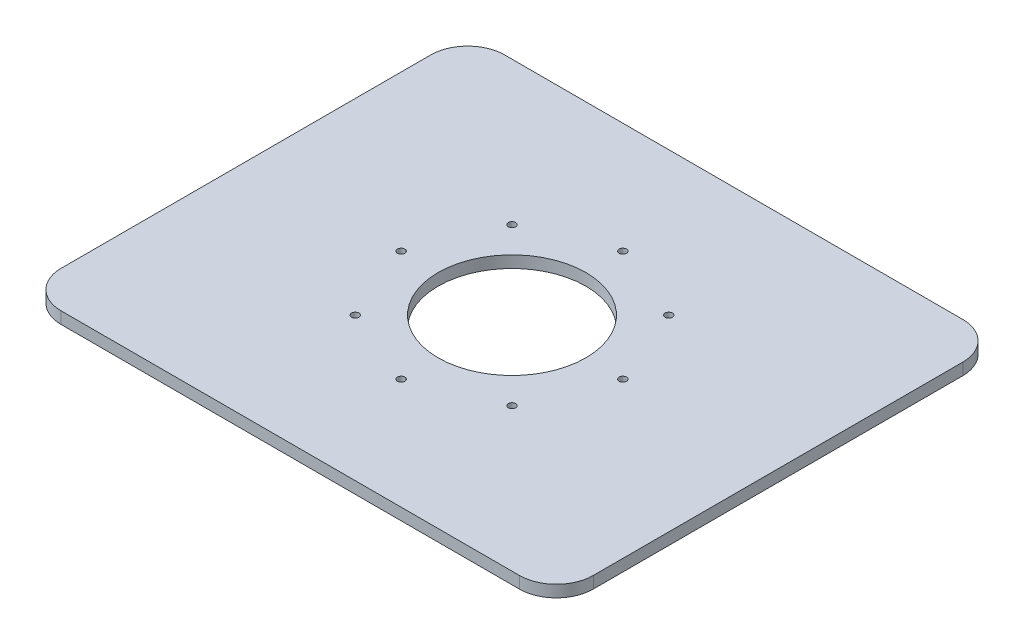
ISO-10303-21;
HEADER;
FILE_DESCRIPTION(('STEP AP214'),'2;1');
FILE_NAME('part.step','',(''),(''),'','','');
FILE_SCHEMA(('AUTOMOTIVE_DESIGN { 1 0 10303 214 1 1 1 1 }'));
ENDSEC;
DATA;
#1=APPLICATION_CONTEXT('core data for automotive mechanical design processes');
#2=APPLICATION_PROTOCOL_DEFINITION('international standard','automotive_design',2000,#1);
#3=PRODUCT_CONTEXT('',#1,'mechanical');
#4=PRODUCT('Part','Part','',(#3));
#5=PRODUCT_RELATED_PRODUCT_CATEGORY('part','',(#4));
#6=PRODUCT_DEFINITION_FORMATION('','',#4);
#7=PRODUCT_DEFINITION_CONTEXT('part definition',#1,'design');
#8=PRODUCT_DEFINITION('design','',#6,#7);
#9=PRODUCT_DEFINITION_SHAPE('','',#8);
#10=(LENGTH_UNIT() NAMED_UNIT(*) SI_UNIT(.MILLI.,.METRE.));
#11=(NAMED_UNIT(*) PLANE_ANGLE_UNIT() SI_UNIT($,.RADIAN.));
#12=(NAMED_UNIT(*) SI_UNIT($,.STERADIAN.) SOLID_ANGLE_UNIT());
#13=UNCERTAINTY_MEASURE_WITH_UNIT(LENGTH_MEASURE(1.E-05),#10,'distance_accuracy_value','');
#14=(GEOMETRIC_REPRESENTATION_CONTEXT(3) GLOBAL_UNCERTAINTY_ASSIGNED_CONTEXT((#13)) GLOBAL_UNIT_ASSIGNED_CONTEXT((#10,
#11,#12)) REPRESENTATION_CONTEXT('',''));
#15=CARTESIAN_POINT('',(0.,0.,0.));
#16=DIRECTION('',(0.,0.,1.));
#17=DIRECTION('',(1.,0.,0.));
#18=AXIS2_PLACEMENT_3D('',#15,#16,#17);
#19=CARTESIAN_POINT('',(310.,16.,250.));
#20=DIRECTION('',(0.,1.,0.));
#21=DIRECTION('',(1.,0.,0.));
#22=AXIS2_PLACEMENT_3D('',#19,#20,#21);
#23=PLANE('',#22);
#24=CARTESIAN_POINT('',(-106.066017178,16.,-106.066017178));
#25=DIRECTION('',(0.,1.,0.));
#26=DIRECTION('',(0.,0.,1.));
#27=AXIS2_PLACEMENT_3D('',#24,#25,#26);
#28=CIRCLE('',#27,5.);
#29=CARTESIAN_POINT('',(-106.066017178,16.,-101.066017178));
#30=VERTEX_POINT('',#29);
#31=EDGE_CURVE('E183',#30,#30,#28,.T.);
#32=ORIENTED_EDGE('',*,*,#31,.F.);
#33=EDGE_LOOP('',(#32));
#34=FACE_BOUND('',#33,.T.);
#35=CARTESIAN_POINT('',(0.,16.,-150.));
#36=DIRECTION('',(0.,1.,0.));
#37=DIRECTION('',(0.,0.,1.));
#38=AXIS2_PLACEMENT_3D('',#35,#36,#37);
#39=CIRCLE('',#38,5.);
#40=CARTESIAN_POINT('',(0.,16.,-145.));
#41=VERTEX_POINT('',#40);
#42=EDGE_CURVE('E207',#41,#41,#39,.T.);
#43=ORIENTED_EDGE('',*,*,#42,.F.);
#44=EDGE_LOOP('',(#43));
#45=FACE_BOUND('',#44,.T.);
#46=CARTESIAN_POINT('',(150.,16.,0.));
#47=DIRECTION('',(0.,1.,0.));
#48=DIRECTION('',(0.,0.,1.));
#49=AXIS2_PLACEMENT_3D('',#46,#47,#48);
#50=CIRCLE('',#49,5.);
#51=CARTESIAN_POINT('',(150.,16.,5.));
#52=VERTEX_POINT('',#51);
#53=EDGE_CURVE('E191',#52,#52,#50,.T.);
#54=ORIENTED_EDGE('',*,*,#53,.F.);
#55=EDGE_LOOP('',(#54));
#56=FACE_BOUND('',#55,.T.);
#57=CARTESIAN_POINT('',(0.,16.,150.));
#58=DIRECTION('',(0.,1.,0.));
#59=DIRECTION('',(0.,0.,1.));
#60=AXIS2_PLACEMENT_3D('',#57,#58,#59);
#61=CIRCLE('',#60,5.);
#62=CARTESIAN_POINT('',(0.,16.,155.));
#63=VERTEX_POINT('',#62);
#64=EDGE_CURVE('E227',#63,#63,#61,.T.);
#65=ORIENTED_EDGE('',*,*,#64,.F.);
#66=EDGE_LOOP('',(#65));
#67=FACE_BOUND('',#66,.T.);
#68=CARTESIAN_POINT('',(-150.,16.,0.));
#69=DIRECTION('',(0.,1.,0.));
#70=DIRECTION('',(0.,0.,1.));
#71=AXIS2_PLACEMENT_3D('',#68,#69,#70);
#72=CIRCLE('',#71,5.);
#73=CARTESIAN_POINT('',(-150.,16.,4.99999999999998));
#74=VERTEX_POINT('',#73);
#75=EDGE_CURVE('E156',#74,#74,#72,.T.);
#76=ORIENTED_EDGE('',*,*,#75,.F.);
#77=EDGE_LOOP('',(#76));
#78=FACE_BOUND('',#77,.T.);
#79=CARTESIAN_POINT('',(-106.066017178,16.,106.066017178));
#80=DIRECTION('',(0.,1.,0.));
#81=DIRECTION('',(0.,0.,1.));
#82=AXIS2_PLACEMENT_3D('',#79,#80,#81);
#83=CIRCLE('',#82,5.);
#84=CARTESIAN_POINT('',(-106.066017178,16.,111.066017178));
#85=VERTEX_POINT('',#84);
#86=EDGE_CURVE('E218',#85,#85,#83,.T.);
#87=ORIENTED_EDGE('',*,*,#86,.F.);
#88=EDGE_LOOP('',(#87));
#89=FACE_BOUND('',#88,.T.);
#90=CARTESIAN_POINT('',(106.066017178,16.,106.066017178));
#91=DIRECTION('',(0.,1.,0.));
#92=DIRECTION('',(0.,0.,1.));
#93=AXIS2_PLACEMENT_3D('',#90,#91,#92);
#94=CIRCLE('',#93,5.);
#95=CARTESIAN_POINT('',(106.066017178,16.,111.066017178));
#96=VERTEX_POINT('',#95);
#97=EDGE_CURVE('E240',#96,#96,#94,.T.);
#98=ORIENTED_EDGE('',*,*,#97,.F.);
#99=EDGE_LOOP('',(#98));
#100=FACE_BOUND('',#99,.T.);
#101=CARTESIAN_POINT('',(106.066017178,16.,-106.066017178));
#102=DIRECTION('',(0.,1.,0.));
#103=DIRECTION('',(0.,0.,1.));
#104=AXIS2_PLACEMENT_3D('',#101,#102,#103);
#105=CIRCLE('',#104,5.);
#106=CARTESIAN_POINT('',(106.066017178,16.,-101.066017178));
#107=VERTEX_POINT('',#106);
#108=EDGE_CURVE('E198',#107,#107,#105,.T.);
#109=ORIENTED_EDGE('',*,*,#108,.F.);
#110=EDGE_LOOP('',(#109));
#111=FACE_BOUND('',#110,.T.);
#112=CARTESIAN_POINT('',(0.,16.,0.));
#113=DIRECTION('',(0.,1.,0.));
#114=DIRECTION('',(0.,0.,1.));
#115=AXIS2_PLACEMENT_3D('',#112,#113,#114);
#116=CIRCLE('',#115,100.);
#117=CARTESIAN_POINT('',(0.,16.,100.));
#118=VERTEX_POINT('',#117);
#119=EDGE_CURVE('E310',#118,#118,#116,.T.);
#120=ORIENTED_EDGE('',*,*,#119,.F.);
#121=EDGE_LOOP('',(#120));
#122=FACE_BOUND('',#121,.T.);
#123=CARTESIAN_POINT('',(310.,16.,250.));
#124=DIRECTION('',(0.,1.,0.));
#125=DIRECTION('',(0.,0.,1.));
#126=AXIS2_PLACEMENT_3D('',#123,#124,#125);
#127=CIRCLE('',#126,50.);
#128=CARTESIAN_POINT('',(310.,16.,300.));
#129=VERTEX_POINT('',#128);
#130=CARTESIAN_POINT('',(360.,16.,250.));
#131=VERTEX_POINT('',#130);
#132=EDGE_CURVE('E45',#129,#131,#127,.T.);
#133=ORIENTED_EDGE('',*,*,#132,.T.);
#134=DIRECTION('',(0.,0.,-1.));
#135=VECTOR('',#134,1.);
#136=CARTESIAN_POINT('',(360.,16.,250.));
#137=LINE('',#136,#135);
#138=CARTESIAN_POINT('',(360.,16.,-250.));
#139=VERTEX_POINT('',#138);
#140=EDGE_CURVE('E20',#131,#139,#137,.T.);
#141=ORIENTED_EDGE('',*,*,#140,.T.);
#142=CARTESIAN_POINT('',(310.,16.,-250.));
#143=DIRECTION('',(0.,1.,0.));
#144=DIRECTION('',(0.,0.,1.));
#145=AXIS2_PLACEMENT_3D('',#142,#143,#144);
#146=CIRCLE('',#145,50.);
#147=CARTESIAN_POINT('',(310.,16.,-300.));
#148=VERTEX_POINT('',#147);
#149=EDGE_CURVE('E114',#139,#148,#146,.T.);
#150=ORIENTED_EDGE('',*,*,#149,.T.);
#151=DIRECTION('',(-1.,0.,0.));
#152=VECTOR('',#151,1.);
#153=CARTESIAN_POINT('',(310.,16.,-300.));
#154=LINE('',#153,#152);
#155=CARTESIAN_POINT('',(-310.,16.,-300.));
#156=VERTEX_POINT('',#155);
#157=EDGE_CURVE('E203',#148,#156,#154,.T.);
#158=ORIENTED_EDGE('',*,*,#157,.T.);
#159=CARTESIAN_POINT('',(-310.,16.,-250.));
#160=DIRECTION('',(0.,1.,0.));
#161=DIRECTION('',(0.,0.,1.));
#162=AXIS2_PLACEMENT_3D('',#159,#160,#161);
#163=CIRCLE('',#162,50.);
#164=CARTESIAN_POINT('',(-360.,16.,-250.));
#165=VERTEX_POINT('',#164);
#166=EDGE_CURVE('E30',#156,#165,#163,.T.);
#167=ORIENTED_EDGE('',*,*,#166,.T.);
#168=DIRECTION('',(0.,0.,1.));
#169=VECTOR('',#168,1.);
#170=CARTESIAN_POINT('',(-360.,16.,-250.));
#171=LINE('',#170,#169);
#172=CARTESIAN_POINT('',(-360.,16.,250.));
#173=VERTEX_POINT('',#172);
#174=EDGE_CURVE('E132',#165,#173,#171,.T.);
#175=ORIENTED_EDGE('',*,*,#174,.T.);
#176=CARTESIAN_POINT('',(-310.,16.,250.));
#177=DIRECTION('',(0.,1.,0.));
#178=DIRECTION('',(0.,0.,1.));
#179=AXIS2_PLACEMENT_3D('',#176,#177,#178);
#180=CIRCLE('',#179,50.);
#181=CARTESIAN_POINT('',(-310.,16.,300.));
#182=VERTEX_POINT('',#181);
#183=EDGE_CURVE('E11',#173,#182,#180,.T.);
#184=ORIENTED_EDGE('',*,*,#183,.T.);
#185=DIRECTION('',(1.,0.,0.));
#186=VECTOR('',#185,1.);
#187=CARTESIAN_POINT('',(-310.,16.,300.));
#188=LINE('',#187,#186);
#189=EDGE_CURVE('E116',#182,#129,#188,.T.);
#190=ORIENTED_EDGE('',*,*,#189,.T.);
#191=EDGE_LOOP('',(#133,#141,#150,#158,#167,#175,#184,#190));
#192=FACE_BOUND('',#191,.T.);
#193=ADVANCED_FACE('F16',(#34,#45,#56,#67,#78,#89,#100,#111,#122,#192),#23,.T.);
#194=CARTESIAN_POINT('',(-310.,-937.229961108798,250.));
#195=DIRECTION('',(0.,1.,0.));
#196=DIRECTION('',(0.,0.,1.));
#197=AXIS2_PLACEMENT_3D('',#194,#195,#196);
#198=CYLINDRICAL_SURFACE('',#197,50.);
#199=CARTESIAN_POINT('',(-310.,0.,250.));
#200=DIRECTION('',(0.,-1.,0.));
#201=DIRECTION('',(0.,0.,1.));
#202=AXIS2_PLACEMENT_3D('',#199,#200,#201);
#203=CIRCLE('',#202,50.);
#204=CARTESIAN_POINT('',(-310.,0.,300.));
#205=VERTEX_POINT('',#204);
#206=CARTESIAN_POINT('',(-360.,0.,250.));
#207=VERTEX_POINT('',#206);
#208=EDGE_CURVE('E147',#205,#207,#203,.T.);
#209=ORIENTED_EDGE('',*,*,#208,.F.);
#210=DIRECTION('',(0.,-1.,0.));
#211=VECTOR('',#210,1.);
#212=CARTESIAN_POINT('',(-310.,-937.229961108798,300.));
#213=LINE('',#212,#211);
#214=EDGE_CURVE('E120',#182,#205,#213,.T.);
#215=ORIENTED_EDGE('',*,*,#214,.F.);
#216=ORIENTED_EDGE('',*,*,#183,.F.);
#217=DIRECTION('',(0.,1.,0.));
#218=VECTOR('',#217,1.);
#219=CARTESIAN_POINT('',(-360.,-937.229961108798,250.));
#220=LINE('',#219,#218);
#221=EDGE_CURVE('E199',#207,#173,#220,.T.);
#222=ORIENTED_EDGE('',*,*,#221,.F.);
#223=EDGE_LOOP('',(#209,#215,#216,#222));
#224=FACE_BOUND('',#223,.T.);
#225=ADVANCED_FACE('F18',(#224),#198,.T.);
#226=CARTESIAN_POINT('',(-310.,-937.229961108798,-250.));
#227=DIRECTION('',(0.,1.,0.));
#228=DIRECTION('',(0.,0.,1.));
#229=AXIS2_PLACEMENT_3D('',#226,#227,#228);
#230=CYLINDRICAL_SURFACE('',#229,50.);
#231=CARTESIAN_POINT('',(-310.,0.,-250.));
#232=DIRECTION('',(0.,-1.,0.));
#233=DIRECTION('',(0.,0.,1.));
#234=AXIS2_PLACEMENT_3D('',#231,#232,#233);
#235=CIRCLE('',#234,50.);
#236=CARTESIAN_POINT('',(-360.,0.,-250.));
#237=VERTEX_POINT('',#236);
#238=CARTESIAN_POINT('',(-310.,0.,-300.));
#239=VERTEX_POINT('',#238);
#240=EDGE_CURVE('E230',#237,#239,#235,.T.);
#241=ORIENTED_EDGE('',*,*,#240,.F.);
#242=DIRECTION('',(0.,-1.,0.));
#243=VECTOR('',#242,1.);
#244=CARTESIAN_POINT('',(-360.,-937.229961108798,-250.));
#245=LINE('',#244,#243);
#246=EDGE_CURVE('E126',#165,#237,#245,.T.);
#247=ORIENTED_EDGE('',*,*,#246,.F.);
#248=ORIENTED_EDGE('',*,*,#166,.F.);
#249=DIRECTION('',(0.,1.,0.));
#250=VECTOR('',#249,1.);
#251=CARTESIAN_POINT('',(-310.,-937.229961108798,-300.));
#252=LINE('',#251,#250);
#253=EDGE_CURVE('E231',#239,#156,#252,.T.);
#254=ORIENTED_EDGE('',*,*,#253,.F.);
#255=EDGE_LOOP('',(#241,#247,#248,#254));
#256=FACE_BOUND('',#255,.T.);
#257=ADVANCED_FACE('F358',(#256),#230,.T.);
#258=CARTESIAN_POINT('',(310.,-937.229961108798,250.));
#259=DIRECTION('',(0.,1.,0.));
#260=DIRECTION('',(0.,0.,1.));
#261=AXIS2_PLACEMENT_3D('',#258,#259,#260);
#262=CYLINDRICAL_SURFACE('',#261,50.);
#263=CARTESIAN_POINT('',(310.,0.,250.));
#264=DIRECTION('',(0.,-1.,0.));
#265=DIRECTION('',(0.,0.,1.));
#266=AXIS2_PLACEMENT_3D('',#263,#264,#265);
#267=CIRCLE('',#266,50.);
#268=CARTESIAN_POINT('',(360.,0.,250.));
#269=VERTEX_POINT('',#268);
#270=CARTESIAN_POINT('',(310.,0.,300.));
#271=VERTEX_POINT('',#270);
#272=EDGE_CURVE('E151',#269,#271,#267,.T.);
#273=ORIENTED_EDGE('',*,*,#272,.F.);
#274=DIRECTION('',(0.,-1.,0.));
#275=VECTOR('',#274,1.);
#276=CARTESIAN_POINT('',(360.,-937.229961108798,250.));
#277=LINE('',#276,#275);
#278=EDGE_CURVE('E109',#131,#269,#277,.T.);
#279=ORIENTED_EDGE('',*,*,#278,.F.);
#280=ORIENTED_EDGE('',*,*,#132,.F.);
#281=DIRECTION('',(0.,1.,0.));
#282=VECTOR('',#281,1.);
#283=CARTESIAN_POINT('',(310.,-937.229961108798,300.));
#284=LINE('',#283,#282);
#285=EDGE_CURVE('E107',#271,#129,#284,.T.);
#286=ORIENTED_EDGE('',*,*,#285,.F.);
#287=EDGE_LOOP('',(#273,#279,#280,#286));
#288=FACE_BOUND('',#287,.T.);
#289=ADVANCED_FACE('F106',(#288),#262,.T.);
#290=CARTESIAN_POINT('',(310.,-937.229961108798,-250.));
#291=DIRECTION('',(0.,1.,0.));
#292=DIRECTION('',(0.,0.,1.));
#293=AXIS2_PLACEMENT_3D('',#290,#291,#292);
#294=CYLINDRICAL_SURFACE('',#293,50.);
#295=CARTESIAN_POINT('',(310.,0.,-250.));
#296=DIRECTION('',(0.,-1.,0.));
#297=DIRECTION('',(0.,0.,1.));
#298=AXIS2_PLACEMENT_3D('',#295,#296,#297);
#299=CIRCLE('',#298,50.);
#300=CARTESIAN_POINT('',(310.,0.,-300.));
#301=VERTEX_POINT('',#300);
#302=CARTESIAN_POINT('',(360.,0.,-250.));
#303=VERTEX_POINT('',#302);
#304=EDGE_CURVE('E245',#301,#303,#299,.T.);
#305=ORIENTED_EDGE('',*,*,#304,.F.);
#306=DIRECTION('',(0.,-1.,0.));
#307=VECTOR('',#306,1.);
#308=CARTESIAN_POINT('',(310.,-937.229961108798,-300.));
#309=LINE('',#308,#307);
#310=EDGE_CURVE('E197',#148,#301,#309,.T.);
#311=ORIENTED_EDGE('',*,*,#310,.F.);
#312=ORIENTED_EDGE('',*,*,#149,.F.);
#313=DIRECTION('',(0.,1.,0.));
#314=VECTOR('',#313,1.);
#315=CARTESIAN_POINT('',(360.,-937.229961108798,-250.));
#316=LINE('',#315,#314);
#317=EDGE_CURVE('E264',#303,#139,#316,.T.);
#318=ORIENTED_EDGE('',*,*,#317,.F.);
#319=EDGE_LOOP('',(#305,#311,#312,#318));
#320=FACE_BOUND('',#319,.T.);
#321=ADVANCED_FACE('F284',(#320),#294,.T.);
#322=CARTESIAN_POINT('',(360.,-937.229961108798,300.));
#323=DIRECTION('',(1.,0.,0.));
#324=DIRECTION('',(0.,1.,0.));
#325=AXIS2_PLACEMENT_3D('',#322,#323,#324);
#326=PLANE('',#325);
#327=DIRECTION('',(0.,0.,1.));
#328=VECTOR('',#327,1.);
#329=CARTESIAN_POINT('',(360.,0.,300.));
#330=LINE('',#329,#328);
#331=EDGE_CURVE('E246',#303,#269,#330,.T.);
#332=ORIENTED_EDGE('',*,*,#331,.F.);
#333=ORIENTED_EDGE('',*,*,#317,.T.);
#334=ORIENTED_EDGE('',*,*,#140,.F.);
#335=ORIENTED_EDGE('',*,*,#278,.T.);
#336=EDGE_LOOP('',(#332,#333,#334,#335));
#337=FACE_BOUND('',#336,.T.);
#338=ADVANCED_FACE('F277',(#337),#326,.T.);
#339=CARTESIAN_POINT('',(-360.,-937.229961108798,300.));
#340=DIRECTION('',(0.,0.,1.));
#341=DIRECTION('',(1.,0.,0.));
#342=AXIS2_PLACEMENT_3D('',#339,#340,#341);
#343=PLANE('',#342);
#344=DIRECTION('',(-1.,0.,0.));
#345=VECTOR('',#344,1.);
#346=CARTESIAN_POINT('',(-360.,0.,300.));
#347=LINE('',#346,#345);
#348=EDGE_CURVE('E121',#271,#205,#347,.T.);
#349=ORIENTED_EDGE('',*,*,#348,.F.);
#350=ORIENTED_EDGE('',*,*,#285,.T.);
#351=ORIENTED_EDGE('',*,*,#189,.F.);
#352=ORIENTED_EDGE('',*,*,#214,.T.);
#353=EDGE_LOOP('',(#349,#350,#351,#352));
#354=FACE_BOUND('',#353,.T.);
#355=ADVANCED_FACE('F125',(#354),#343,.T.);
#356=CARTESIAN_POINT('',(-360.,-937.229961108798,300.));
#357=DIRECTION('',(-1.,0.,0.));
#358=DIRECTION('',(0.,0.,1.));
#359=AXIS2_PLACEMENT_3D('',#356,#357,#358);
#360=PLANE('',#359);
#361=ORIENTED_EDGE('',*,*,#221,.T.);
#362=ORIENTED_EDGE('',*,*,#174,.F.);
#363=ORIENTED_EDGE('',*,*,#246,.T.);
#364=DIRECTION('',(0.,0.,-1.));
#365=VECTOR('',#364,1.);
#366=CARTESIAN_POINT('',(-360.,0.,300.));
#367=LINE('',#366,#365);
#368=EDGE_CURVE('E233',#207,#237,#367,.T.);
#369=ORIENTED_EDGE('',*,*,#368,.F.);
#370=EDGE_LOOP('',(#361,#362,#363,#369));
#371=FACE_BOUND('',#370,.T.);
#372=ADVANCED_FACE('F391',(#371),#360,.T.);
#373=CARTESIAN_POINT('',(-360.,-937.229961108798,-300.));
#374=DIRECTION('',(0.,0.,-1.));
#375=DIRECTION('',(0.,-1.,0.));
#376=AXIS2_PLACEMENT_3D('',#373,#374,#375);
#377=PLANE('',#376);
#378=ORIENTED_EDGE('',*,*,#253,.T.);
#379=ORIENTED_EDGE('',*,*,#157,.F.);
#380=ORIENTED_EDGE('',*,*,#310,.T.);
#381=DIRECTION('',(1.,0.,0.));
#382=VECTOR('',#381,1.);
#383=CARTESIAN_POINT('',(-360.,0.,-300.));
#384=LINE('',#383,#382);
#385=EDGE_CURVE('E239',#239,#301,#384,.T.);
#386=ORIENTED_EDGE('',*,*,#385,.F.);
#387=EDGE_LOOP('',(#378,#379,#380,#386));
#388=FACE_BOUND('',#387,.T.);
#389=ADVANCED_FACE('F287',(#388),#377,.T.);
#390=CARTESIAN_POINT('',(106.066017178,4.,106.066017178));
#391=DIRECTION('',(0.,1.,0.));
#392=DIRECTION('',(1.,0.,0.));
#393=AXIS2_PLACEMENT_3D('',#390,#391,#392);
#394=PLANE('',#393);
#395=CARTESIAN_POINT('',(106.066017178,4.,106.066017178));
#396=DIRECTION('',(0.,-1.,0.));
#397=DIRECTION('',(0.,0.,1.));
#398=AXIS2_PLACEMENT_3D('',#395,#396,#397);
#399=CIRCLE('',#398,2.75);
#400=CARTESIAN_POINT('',(106.066017178,4.,108.816017178));
#401=VERTEX_POINT('',#400);
#402=EDGE_CURVE('E179',#401,#401,#399,.T.);
#403=ORIENTED_EDGE('',*,*,#402,.T.);
#404=EDGE_LOOP('',(#403));
#405=FACE_BOUND('',#404,.T.);
#406=CARTESIAN_POINT('',(106.066017178,4.,106.066017178));
#407=DIRECTION('',(0.,1.,0.));
#408=DIRECTION('',(0.,0.,1.));
#409=AXIS2_PLACEMENT_3D('',#406,#407,#408);
#410=CIRCLE('',#409,5.);
#411=CARTESIAN_POINT('',(106.066017178,4.,111.066017178));
#412=VERTEX_POINT('',#411);
#413=EDGE_CURVE('E241',#412,#412,#410,.T.);
#414=ORIENTED_EDGE('',*,*,#413,.T.);
#415=EDGE_LOOP('',(#414));
#416=FACE_BOUND('',#415,.T.);
#417=ADVANCED_FACE('F383',(#405,#416),#394,.T.);
#418=CARTESIAN_POINT('',(0.,4.,150.));
#419=DIRECTION('',(0.,1.,0.));
#420=DIRECTION('',(1.,0.,0.));
#421=AXIS2_PLACEMENT_3D('',#418,#419,#420);
#422=PLANE('',#421);
#423=CARTESIAN_POINT('',(0.,4.,150.));
#424=DIRECTION('',(0.,-1.,0.));
#425=DIRECTION('',(0.,0.,1.));
#426=AXIS2_PLACEMENT_3D('',#423,#424,#425);
#427=CIRCLE('',#426,2.75);
#428=CARTESIAN_POINT('',(0.,4.,152.75));
#429=VERTEX_POINT('',#428);
#430=EDGE_CURVE('E171',#429,#429,#427,.T.);
#431=ORIENTED_EDGE('',*,*,#430,.T.);
#432=EDGE_LOOP('',(#431));
#433=FACE_BOUND('',#432,.T.);
#434=CARTESIAN_POINT('',(0.,4.,150.));
#435=DIRECTION('',(0.,1.,0.));
#436=DIRECTION('',(0.,0.,1.));
#437=AXIS2_PLACEMENT_3D('',#434,#435,#436);
#438=CIRCLE('',#437,5.);
#439=CARTESIAN_POINT('',(0.,4.,155.));
#440=VERTEX_POINT('',#439);
#441=EDGE_CURVE('E224',#440,#440,#438,.T.);
#442=ORIENTED_EDGE('',*,*,#441,.T.);
#443=EDGE_LOOP('',(#442));
#444=FACE_BOUND('',#443,.T.);
#445=ADVANCED_FACE('F379',(#433,#444),#422,.T.);
#446=CARTESIAN_POINT('',(-106.066017178,4.,106.066017178));
#447=DIRECTION('',(0.,1.,0.));
#448=DIRECTION('',(1.,0.,0.));
#449=AXIS2_PLACEMENT_3D('',#446,#447,#448);
#450=PLANE('',#449);
#451=CARTESIAN_POINT('',(-106.066017178,4.,106.066017178));
#452=DIRECTION('',(0.,-1.,0.));
#453=DIRECTION('',(0.,0.,1.));
#454=AXIS2_PLACEMENT_3D('',#451,#452,#453);
#455=CIRCLE('',#454,2.75);
#456=CARTESIAN_POINT('',(-106.066017178,4.,108.816017178));
#457=VERTEX_POINT('',#456);
#458=EDGE_CURVE('E154',#457,#457,#455,.T.);
#459=ORIENTED_EDGE('',*,*,#458,.T.);
#460=EDGE_LOOP('',(#459));
#461=FACE_BOUND('',#460,.T.);
#462=CARTESIAN_POINT('',(-106.066017178,4.,106.066017178));
#463=DIRECTION('',(0.,1.,0.));
#464=DIRECTION('',(0.,0.,1.));
#465=AXIS2_PLACEMENT_3D('',#462,#463,#464);
#466=CIRCLE('',#465,5.);
#467=CARTESIAN_POINT('',(-106.066017178,4.,111.066017178));
#468=VERTEX_POINT('',#467);
#469=EDGE_CURVE('E159',#468,#468,#466,.T.);
#470=ORIENTED_EDGE('',*,*,#469,.T.);
#471=EDGE_LOOP('',(#470));
#472=FACE_BOUND('',#471,.T.);
#473=ADVANCED_FACE('F334',(#461,#472),#450,.T.);
#474=CARTESIAN_POINT('',(-150.,4.,0.));
#475=DIRECTION('',(0.,1.,0.));
#476=DIRECTION('',(1.,0.,0.));
#477=AXIS2_PLACEMENT_3D('',#474,#475,#476);
#478=PLANE('',#477);
#479=CARTESIAN_POINT('',(-150.,4.,0.));
#480=DIRECTION('',(0.,-1.,0.));
#481=DIRECTION('',(0.,0.,1.));
#482=AXIS2_PLACEMENT_3D('',#479,#480,#481);
#483=CIRCLE('',#482,2.75);
#484=CARTESIAN_POINT('',(-150.,4.,2.74999999999998));
#485=VERTEX_POINT('',#484);
#486=EDGE_CURVE('E141',#485,#485,#483,.T.);
#487=ORIENTED_EDGE('',*,*,#486,.T.);
#488=EDGE_LOOP('',(#487));
#489=FACE_BOUND('',#488,.T.);
#490=CARTESIAN_POINT('',(-150.,4.,0.));
#491=DIRECTION('',(0.,1.,0.));
#492=DIRECTION('',(0.,0.,1.));
#493=AXIS2_PLACEMENT_3D('',#490,#491,#492);
#494=CIRCLE('',#493,5.);
#495=CARTESIAN_POINT('',(-150.,4.,4.99999999999998));
#496=VERTEX_POINT('',#495);
#497=EDGE_CURVE('E161',#496,#496,#494,.T.);
#498=ORIENTED_EDGE('',*,*,#497,.T.);
#499=EDGE_LOOP('',(#498));
#500=FACE_BOUND('',#499,.T.);
#501=ADVANCED_FACE('F373',(#489,#500),#478,.T.);
#502=CARTESIAN_POINT('',(-106.066017178,4.,-106.066017178));
#503=DIRECTION('',(0.,1.,0.));
#504=DIRECTION('',(1.,0.,0.));
#505=AXIS2_PLACEMENT_3D('',#502,#503,#504);
#506=PLANE('',#505);
#507=CARTESIAN_POINT('',(-106.066017178,4.,-106.066017178));
#508=DIRECTION('',(0.,-1.,0.));
#509=DIRECTION('',(0.,0.,1.));
#510=AXIS2_PLACEMENT_3D('',#507,#508,#509);
#511=CIRCLE('',#510,2.75);
#512=CARTESIAN_POINT('',(-106.066017178,4.,-103.316017178));
#513=VERTEX_POINT('',#512);
#514=EDGE_CURVE('E140',#513,#513,#511,.T.);
#515=ORIENTED_EDGE('',*,*,#514,.T.);
#516=EDGE_LOOP('',(#515));
#517=FACE_BOUND('',#516,.T.);
#518=CARTESIAN_POINT('',(-106.066017178,4.,-106.066017178));
#519=DIRECTION('',(0.,1.,0.));
#520=DIRECTION('',(0.,0.,1.));
#521=AXIS2_PLACEMENT_3D('',#518,#519,#520);
#522=CIRCLE('',#521,5.);
#523=CARTESIAN_POINT('',(-106.066017178,4.,-101.066017178));
#524=VERTEX_POINT('',#523);
#525=EDGE_CURVE('E190',#524,#524,#522,.T.);
#526=ORIENTED_EDGE('',*,*,#525,.T.);
#527=EDGE_LOOP('',(#526));
#528=FACE_BOUND('',#527,.T.);
#529=ADVANCED_FACE('F369',(#517,#528),#506,.T.);
#530=CARTESIAN_POINT('',(0.,4.,-150.));
#531=DIRECTION('',(0.,1.,0.));
#532=DIRECTION('',(1.,0.,0.));
#533=AXIS2_PLACEMENT_3D('',#530,#531,#532);
#534=PLANE('',#533);
#535=CARTESIAN_POINT('',(0.,4.,-150.));
#536=DIRECTION('',(0.,-1.,0.));
#537=DIRECTION('',(0.,0.,1.));
#538=AXIS2_PLACEMENT_3D('',#535,#536,#537);
#539=CIRCLE('',#538,2.75);
#540=CARTESIAN_POINT('',(0.,4.,-147.25));
#541=VERTEX_POINT('',#540);
#542=EDGE_CURVE('E292',#541,#541,#539,.T.);
#543=ORIENTED_EDGE('',*,*,#542,.T.);
#544=EDGE_LOOP('',(#543));
#545=FACE_BOUND('',#544,.T.);
#546=CARTESIAN_POINT('',(0.,4.,-150.));
#547=DIRECTION('',(0.,1.,0.));
#548=DIRECTION('',(0.,0.,1.));
#549=AXIS2_PLACEMENT_3D('',#546,#547,#548);
#550=CIRCLE('',#549,5.);
#551=CARTESIAN_POINT('',(0.,4.,-145.));
#552=VERTEX_POINT('',#551);
#553=EDGE_CURVE('E202',#552,#552,#550,.T.);
#554=ORIENTED_EDGE('',*,*,#553,.T.);
#555=EDGE_LOOP('',(#554));
#556=FACE_BOUND('',#555,.T.);
#557=ADVANCED_FACE('F364',(#545,#556),#534,.T.);
#558=CARTESIAN_POINT('',(106.066017178,4.,-106.066017178));
#559=DIRECTION('',(0.,1.,0.));
#560=DIRECTION('',(1.,0.,0.));
#561=AXIS2_PLACEMENT_3D('',#558,#559,#560);
#562=PLANE('',#561);
#563=CARTESIAN_POINT('',(106.066017178,4.,-106.066017178));
#564=DIRECTION('',(0.,-1.,0.));
#565=DIRECTION('',(0.,0.,1.));
#566=AXIS2_PLACEMENT_3D('',#563,#564,#565);
#567=CIRCLE('',#566,2.75);
#568=CARTESIAN_POINT('',(106.066017178,4.,-103.316017178));
#569=VERTEX_POINT('',#568);
#570=EDGE_CURVE('E316',#569,#569,#567,.T.);
#571=ORIENTED_EDGE('',*,*,#570,.T.);
#572=EDGE_LOOP('',(#571));
#573=FACE_BOUND('',#572,.T.);
#574=CARTESIAN_POINT('',(106.066017178,4.,-106.066017178));
#575=DIRECTION('',(0.,1.,0.));
#576=DIRECTION('',(0.,0.,1.));
#577=AXIS2_PLACEMENT_3D('',#574,#575,#576);
#578=CIRCLE('',#577,5.);
#579=CARTESIAN_POINT('',(106.066017178,4.,-101.066017178));
#580=VERTEX_POINT('',#579);
#581=EDGE_CURVE('E195',#580,#580,#578,.T.);
#582=ORIENTED_EDGE('',*,*,#581,.T.);
#583=EDGE_LOOP('',(#582));
#584=FACE_BOUND('',#583,.T.);
#585=ADVANCED_FACE('F366',(#573,#584),#562,.T.);
#586=CARTESIAN_POINT('',(150.,4.,0.));
#587=DIRECTION('',(0.,1.,0.));
#588=DIRECTION('',(1.,0.,0.));
#589=AXIS2_PLACEMENT_3D('',#586,#587,#588);
#590=PLANE('',#589);
#591=CARTESIAN_POINT('',(150.,4.,0.));
#592=DIRECTION('',(0.,-1.,0.));
#593=DIRECTION('',(0.,0.,1.));
#594=AXIS2_PLACEMENT_3D('',#591,#592,#593);
#595=CIRCLE('',#594,2.75);
#596=CARTESIAN_POINT('',(150.,4.,2.75));
#597=VERTEX_POINT('',#596);
#598=EDGE_CURVE('E299',#597,#597,#595,.T.);
#599=ORIENTED_EDGE('',*,*,#598,.T.);
#600=EDGE_LOOP('',(#599));
#601=FACE_BOUND('',#600,.T.);
#602=CARTESIAN_POINT('',(150.,4.,0.));
#603=DIRECTION('',(0.,1.,0.));
#604=DIRECTION('',(0.,0.,1.));
#605=AXIS2_PLACEMENT_3D('',#602,#603,#604);
#606=CIRCLE('',#605,5.);
#607=CARTESIAN_POINT('',(150.,4.,5.));
#608=VERTEX_POINT('',#607);
#609=EDGE_CURVE('E181',#608,#608,#606,.T.);
#610=ORIENTED_EDGE('',*,*,#609,.T.);
#611=EDGE_LOOP('',(#610));
#612=FACE_BOUND('',#611,.T.);
#613=ADVANCED_FACE('F1023',(#601,#612),#590,.T.);
#614=CARTESIAN_POINT('',(0.,0.,0.));
#615=DIRECTION('',(0.,1.,0.));
#616=DIRECTION('',(1.,0.,0.));
#617=AXIS2_PLACEMENT_3D('',#614,#615,#616);
#618=PLANE('',#617);
#619=CARTESIAN_POINT('',(106.066017178,0.,106.066017178));
#620=DIRECTION('',(0.,-1.,0.));
#621=DIRECTION('',(0.,0.,1.));
#622=AXIS2_PLACEMENT_3D('',#619,#620,#621);
#623=CIRCLE('',#622,2.75);
#624=CARTESIAN_POINT('',(106.066017178,0.,108.816017178));
#625=VERTEX_POINT('',#624);
#626=EDGE_CURVE('E173',#625,#625,#623,.T.);
#627=ORIENTED_EDGE('',*,*,#626,.F.);
#628=EDGE_LOOP('',(#627));
#629=FACE_BOUND('',#628,.T.);
#630=CARTESIAN_POINT('',(0.,0.,150.));
#631=DIRECTION('',(0.,-1.,0.));
#632=DIRECTION('',(0.,0.,1.));
#633=AXIS2_PLACEMENT_3D('',#630,#631,#632);
#634=CIRCLE('',#633,2.75);
#635=CARTESIAN_POINT('',(0.,0.,152.75));
#636=VERTEX_POINT('',#635);
#637=EDGE_CURVE('E164',#636,#636,#634,.T.);
#638=ORIENTED_EDGE('',*,*,#637,.F.);
#639=EDGE_LOOP('',(#638));
#640=FACE_BOUND('',#639,.T.);
#641=CARTESIAN_POINT('',(-106.066017178,0.,106.066017178));
#642=DIRECTION('',(0.,-1.,0.));
#643=DIRECTION('',(0.,0.,1.));
#644=AXIS2_PLACEMENT_3D('',#641,#642,#643);
#645=CIRCLE('',#644,2.75);
#646=CARTESIAN_POINT('',(-106.066017178,0.,108.816017178));
#647=VERTEX_POINT('',#646);
#648=EDGE_CURVE('E150',#647,#647,#645,.T.);
#649=ORIENTED_EDGE('',*,*,#648,.F.);
#650=EDGE_LOOP('',(#649));
#651=FACE_BOUND('',#650,.T.);
#652=CARTESIAN_POINT('',(-150.,0.,0.));
#653=DIRECTION('',(0.,-1.,0.));
#654=DIRECTION('',(0.,0.,1.));
#655=AXIS2_PLACEMENT_3D('',#652,#653,#654);
#656=CIRCLE('',#655,2.75);
#657=CARTESIAN_POINT('',(-150.,0.,2.74999999999998));
#658=VERTEX_POINT('',#657);
#659=EDGE_CURVE('E137',#658,#658,#656,.T.);
#660=ORIENTED_EDGE('',*,*,#659,.F.);
#661=EDGE_LOOP('',(#660));
#662=FACE_BOUND('',#661,.T.);
#663=CARTESIAN_POINT('',(-106.066017178,0.,-106.066017178));
#664=DIRECTION('',(0.,-1.,0.));
#665=DIRECTION('',(0.,0.,1.));
#666=AXIS2_PLACEMENT_3D('',#663,#664,#665);
#667=CIRCLE('',#666,2.75);
#668=CARTESIAN_POINT('',(-106.066017178,0.,-103.316017178));
#669=VERTEX_POINT('',#668);
#670=EDGE_CURVE('E297',#669,#669,#667,.T.);
#671=ORIENTED_EDGE('',*,*,#670,.F.);
#672=EDGE_LOOP('',(#671));
#673=FACE_BOUND('',#672,.T.);
#674=CARTESIAN_POINT('',(0.,0.,-150.));
#675=DIRECTION('',(0.,-1.,0.));
#676=DIRECTION('',(0.,0.,1.));
#677=AXIS2_PLACEMENT_3D('',#674,#675,#676);
#678=CIRCLE('',#677,2.75);
#679=CARTESIAN_POINT('',(0.,0.,-147.25));
#680=VERTEX_POINT('',#679);
#681=EDGE_CURVE('E298',#680,#680,#678,.T.);
#682=ORIENTED_EDGE('',*,*,#681,.F.);
#683=EDGE_LOOP('',(#682));
#684=FACE_BOUND('',#683,.T.);
#685=CARTESIAN_POINT('',(106.066017178,0.,-106.066017178));
#686=DIRECTION('',(0.,-1.,0.));
#687=DIRECTION('',(0.,0.,1.));
#688=AXIS2_PLACEMENT_3D('',#685,#686,#687);
#689=CIRCLE('',#688,2.75);
#690=CARTESIAN_POINT('',(106.066017178,0.,-103.316017178));
#691=VERTEX_POINT('',#690);
#692=EDGE_CURVE('E303',#691,#691,#689,.T.);
#693=ORIENTED_EDGE('',*,*,#692,.F.);
#694=EDGE_LOOP('',(#693));
#695=FACE_BOUND('',#694,.T.);
#696=CARTESIAN_POINT('',(150.,0.,0.));
#697=DIRECTION('',(0.,-1.,0.));
#698=DIRECTION('',(0.,0.,1.));
#699=AXIS2_PLACEMENT_3D('',#696,#697,#698);
#700=CIRCLE('',#699,2.75);
#701=CARTESIAN_POINT('',(150.,0.,2.75));
#702=VERTEX_POINT('',#701);
#703=EDGE_CURVE('E302',#702,#702,#700,.T.);
#704=ORIENTED_EDGE('',*,*,#703,.F.);
#705=EDGE_LOOP('',(#704));
#706=FACE_BOUND('',#705,.T.);
#707=CARTESIAN_POINT('',(0.,0.,0.));
#708=DIRECTION('',(0.,-1.,0.));
#709=DIRECTION('',(0.,0.,1.));
#710=AXIS2_PLACEMENT_3D('',#707,#708,#709);
#711=CIRCLE('',#710,100.);
#712=CARTESIAN_POINT('',(0.,0.,100.));
#713=VERTEX_POINT('',#712);
#714=EDGE_CURVE('E534',#713,#713,#711,.T.);
#715=ORIENTED_EDGE('',*,*,#714,.F.);
#716=EDGE_LOOP('',(#715));
#717=FACE_BOUND('',#716,.T.);
#718=ORIENTED_EDGE('',*,*,#385,.T.);
#719=ORIENTED_EDGE('',*,*,#304,.T.);
#720=ORIENTED_EDGE('',*,*,#331,.T.);
#721=ORIENTED_EDGE('',*,*,#272,.T.);
#722=ORIENTED_EDGE('',*,*,#348,.T.);
#723=ORIENTED_EDGE('',*,*,#208,.T.);
#724=ORIENTED_EDGE('',*,*,#368,.T.);
#725=ORIENTED_EDGE('',*,*,#240,.T.);
#726=EDGE_LOOP('',(#718,#719,#720,#721,#722,#723,#724,#725));
#727=FACE_BOUND('',#726,.T.);
#728=ADVANCED_FACE('F276',(#629,#640,#651,#662,#673,#684,#695,#706,#717,#727),#618,.F.);
#729=CARTESIAN_POINT('',(106.066017178,-210.8699850374,106.066017178));
#730=DIRECTION('',(0.,1.,0.));
#731=DIRECTION('',(0.,0.,1.));
#732=AXIS2_PLACEMENT_3D('',#729,#730,#731);
#733=CYLINDRICAL_SURFACE('',#732,5.);
#734=ORIENTED_EDGE('',*,*,#97,.T.);
#735=EDGE_LOOP('',(#734));
#736=FACE_BOUND('',#735,.T.);
#737=ORIENTED_EDGE('',*,*,#413,.F.);
#738=EDGE_LOOP('',(#737));
#739=FACE_BOUND('',#738,.T.);
#740=ADVANCED_FACE('F347',(#736,#739),#733,.F.);
#741=CARTESIAN_POINT('',(0.,-210.8699850374,150.));
#742=DIRECTION('',(0.,1.,0.));
#743=DIRECTION('',(0.,0.,1.));
#744=AXIS2_PLACEMENT_3D('',#741,#742,#743);
#745=CYLINDRICAL_SURFACE('',#744,5.);
#746=ORIENTED_EDGE('',*,*,#64,.T.);
#747=EDGE_LOOP('',(#746));
#748=FACE_BOUND('',#747,.T.);
#749=ORIENTED_EDGE('',*,*,#441,.F.);
#750=EDGE_LOOP('',(#749));
#751=FACE_BOUND('',#750,.T.);
#752=ADVANCED_FACE('F339',(#748,#751),#745,.F.);
#753=CARTESIAN_POINT('',(-106.066017178,-210.8699850374,106.066017178));
#754=DIRECTION('',(0.,1.,0.));
#755=DIRECTION('',(0.,0.,1.));
#756=AXIS2_PLACEMENT_3D('',#753,#754,#755);
#757=CYLINDRICAL_SURFACE('',#756,5.);
#758=ORIENTED_EDGE('',*,*,#86,.T.);
#759=EDGE_LOOP('',(#758));
#760=FACE_BOUND('',#759,.T.);
#761=ORIENTED_EDGE('',*,*,#469,.F.);
#762=EDGE_LOOP('',(#761));
#763=FACE_BOUND('',#762,.T.);
#764=ADVANCED_FACE('F333',(#760,#763),#757,.F.);
#765=CARTESIAN_POINT('',(-150.,-210.8699850374,0.));
#766=DIRECTION('',(0.,1.,0.));
#767=DIRECTION('',(0.,0.,1.));
#768=AXIS2_PLACEMENT_3D('',#765,#766,#767);
#769=CYLINDRICAL_SURFACE('',#768,5.);
#770=ORIENTED_EDGE('',*,*,#75,.T.);
#771=EDGE_LOOP('',(#770));
#772=FACE_BOUND('',#771,.T.);
#773=ORIENTED_EDGE('',*,*,#497,.F.);
#774=EDGE_LOOP('',(#773));
#775=FACE_BOUND('',#774,.T.);
#776=ADVANCED_FACE('F337',(#772,#775),#769,.F.);
#777=CARTESIAN_POINT('',(-106.066017178,-210.8699850374,-106.066017178));
#778=DIRECTION('',(0.,1.,0.));
#779=DIRECTION('',(0.,0.,1.));
#780=AXIS2_PLACEMENT_3D('',#777,#778,#779);
#781=CYLINDRICAL_SURFACE('',#780,5.);
#782=ORIENTED_EDGE('',*,*,#31,.T.);
#783=EDGE_LOOP('',(#782));
#784=FACE_BOUND('',#783,.T.);
#785=ORIENTED_EDGE('',*,*,#525,.F.);
#786=EDGE_LOOP('',(#785));
#787=FACE_BOUND('',#786,.T.);
#788=ADVANCED_FACE('F350',(#784,#787),#781,.F.);
#789=CARTESIAN_POINT('',(0.,-210.8699850374,-150.));
#790=DIRECTION('',(0.,1.,0.));
#791=DIRECTION('',(0.,0.,1.));
#792=AXIS2_PLACEMENT_3D('',#789,#790,#791);
#793=CYLINDRICAL_SURFACE('',#792,5.);
#794=ORIENTED_EDGE('',*,*,#42,.T.);
#795=EDGE_LOOP('',(#794));
#796=FACE_BOUND('',#795,.T.);
#797=ORIENTED_EDGE('',*,*,#553,.F.);
#798=EDGE_LOOP('',(#797));
#799=FACE_BOUND('',#798,.T.);
#800=ADVANCED_FACE('F782',(#796,#799),#793,.F.);
#801=CARTESIAN_POINT('',(106.066017178,-210.8699850374,-106.066017178));
#802=DIRECTION('',(0.,1.,0.));
#803=DIRECTION('',(0.,0.,1.));
#804=AXIS2_PLACEMENT_3D('',#801,#802,#803);
#805=CYLINDRICAL_SURFACE('',#804,5.);
#806=ORIENTED_EDGE('',*,*,#108,.T.);
#807=EDGE_LOOP('',(#806));
#808=FACE_BOUND('',#807,.T.);
#809=ORIENTED_EDGE('',*,*,#581,.F.);
#810=EDGE_LOOP('',(#809));
#811=FACE_BOUND('',#810,.T.);
#812=ADVANCED_FACE('F768',(#808,#811),#805,.F.);
#813=CARTESIAN_POINT('',(150.,-210.8699850374,0.));
#814=DIRECTION('',(0.,1.,0.));
#815=DIRECTION('',(0.,0.,1.));
#816=AXIS2_PLACEMENT_3D('',#813,#814,#815);
#817=CYLINDRICAL_SURFACE('',#816,5.);
#818=ORIENTED_EDGE('',*,*,#53,.T.);
#819=EDGE_LOOP('',(#818));
#820=FACE_BOUND('',#819,.T.);
#821=ORIENTED_EDGE('',*,*,#609,.F.);
#822=EDGE_LOOP('',(#821));
#823=FACE_BOUND('',#822,.T.);
#824=ADVANCED_FACE('F760',(#820,#823),#817,.F.);
#825=CARTESIAN_POINT('',(106.066017178,-210.8699850374,106.066017178));
#826=DIRECTION('',(0.,1.,0.));
#827=DIRECTION('',(0.,0.,1.));
#828=AXIS2_PLACEMENT_3D('',#825,#826,#827);
#829=CYLINDRICAL_SURFACE('',#828,2.75);
#830=ORIENTED_EDGE('',*,*,#402,.F.);
#831=EDGE_LOOP('',(#830));
#832=FACE_BOUND('',#831,.T.);
#833=ORIENTED_EDGE('',*,*,#626,.T.);
#834=EDGE_LOOP('',(#833));
#835=FACE_BOUND('',#834,.T.);
#836=ADVANCED_FACE('F742',(#832,#835),#829,.F.);
#837=CARTESIAN_POINT('',(0.,-210.8699850374,150.));
#838=DIRECTION('',(0.,1.,0.));
#839=DIRECTION('',(0.,0.,1.));
#840=AXIS2_PLACEMENT_3D('',#837,#838,#839);
#841=CYLINDRICAL_SURFACE('',#840,2.75);
#842=ORIENTED_EDGE('',*,*,#430,.F.);
#843=EDGE_LOOP('',(#842));
#844=FACE_BOUND('',#843,.T.);
#845=ORIENTED_EDGE('',*,*,#637,.T.);
#846=EDGE_LOOP('',(#845));
#847=FACE_BOUND('',#846,.T.);
#848=ADVANCED_FACE('F735',(#844,#847),#841,.F.);
#849=CARTESIAN_POINT('',(-106.066017178,-210.8699850374,106.066017178));
#850=DIRECTION('',(0.,1.,0.));
#851=DIRECTION('',(0.,0.,1.));
#852=AXIS2_PLACEMENT_3D('',#849,#850,#851);
#853=CYLINDRICAL_SURFACE('',#852,2.75);
#854=ORIENTED_EDGE('',*,*,#458,.F.);
#855=EDGE_LOOP('',(#854));
#856=FACE_BOUND('',#855,.T.);
#857=ORIENTED_EDGE('',*,*,#648,.T.);
#858=EDGE_LOOP('',(#857));
#859=FACE_BOUND('',#858,.T.);
#860=ADVANCED_FACE('F716',(#856,#859),#853,.F.);
#861=CARTESIAN_POINT('',(-150.,-210.8699850374,0.));
#862=DIRECTION('',(0.,1.,0.));
#863=DIRECTION('',(0.,0.,1.));
#864=AXIS2_PLACEMENT_3D('',#861,#862,#863);
#865=CYLINDRICAL_SURFACE('',#864,2.75);
#866=ORIENTED_EDGE('',*,*,#486,.F.);
#867=EDGE_LOOP('',(#866));
#868=FACE_BOUND('',#867,.T.);
#869=ORIENTED_EDGE('',*,*,#659,.T.);
#870=EDGE_LOOP('',(#869));
#871=FACE_BOUND('',#870,.T.);
#872=ADVANCED_FACE('F704',(#868,#871),#865,.F.);
#873=CARTESIAN_POINT('',(-106.066017178,-210.8699850374,-106.066017178));
#874=DIRECTION('',(0.,1.,0.));
#875=DIRECTION('',(0.,0.,1.));
#876=AXIS2_PLACEMENT_3D('',#873,#874,#875);
#877=CYLINDRICAL_SURFACE('',#876,2.75);
#878=ORIENTED_EDGE('',*,*,#514,.F.);
#879=EDGE_LOOP('',(#878));
#880=FACE_BOUND('',#879,.T.);
#881=ORIENTED_EDGE('',*,*,#670,.T.);
#882=EDGE_LOOP('',(#881));
#883=FACE_BOUND('',#882,.T.);
#884=ADVANCED_FACE('F693',(#880,#883),#877,.F.);
#885=CARTESIAN_POINT('',(0.,-210.8699850374,-150.));
#886=DIRECTION('',(0.,1.,0.));
#887=DIRECTION('',(0.,0.,1.));
#888=AXIS2_PLACEMENT_3D('',#885,#886,#887);
#889=CYLINDRICAL_SURFACE('',#888,2.75);
#890=ORIENTED_EDGE('',*,*,#542,.F.);
#891=EDGE_LOOP('',(#890));
#892=FACE_BOUND('',#891,.T.);
#893=ORIENTED_EDGE('',*,*,#681,.T.);
#894=EDGE_LOOP('',(#893));
#895=FACE_BOUND('',#894,.T.);
#896=ADVANCED_FACE('F680',(#892,#895),#889,.F.);
#897=CARTESIAN_POINT('',(106.066017178,-210.8699850374,-106.066017178));
#898=DIRECTION('',(0.,1.,0.));
#899=DIRECTION('',(0.,0.,1.));
#900=AXIS2_PLACEMENT_3D('',#897,#898,#899);
#901=CYLINDRICAL_SURFACE('',#900,2.75);
#902=ORIENTED_EDGE('',*,*,#570,.F.);
#903=EDGE_LOOP('',(#902));
#904=FACE_BOUND('',#903,.T.);
#905=ORIENTED_EDGE('',*,*,#692,.T.);
#906=EDGE_LOOP('',(#905));
#907=FACE_BOUND('',#906,.T.);
#908=ADVANCED_FACE('F665',(#904,#907),#901,.F.);
#909=CARTESIAN_POINT('',(150.,-210.8699850374,0.));
#910=DIRECTION('',(0.,1.,0.));
#911=DIRECTION('',(0.,0.,1.));
#912=AXIS2_PLACEMENT_3D('',#909,#910,#911);
#913=CYLINDRICAL_SURFACE('',#912,2.75);
#914=ORIENTED_EDGE('',*,*,#598,.F.);
#915=EDGE_LOOP('',(#914));
#916=FACE_BOUND('',#915,.T.);
#917=ORIENTED_EDGE('',*,*,#703,.T.);
#918=EDGE_LOOP('',(#917));
#919=FACE_BOUND('',#918,.T.);
#920=ADVANCED_FACE('F650',(#916,#919),#913,.F.);
#921=CARTESIAN_POINT('',(0.,0.,0.));
#922=DIRECTION('',(0.,1.,0.));
#923=DIRECTION('',(0.,0.,1.));
#924=AXIS2_PLACEMENT_3D('',#921,#922,#923);
#925=CYLINDRICAL_SURFACE('',#924,100.);
#926=ORIENTED_EDGE('',*,*,#119,.T.);
#927=EDGE_LOOP('',(#926));
#928=FACE_BOUND('',#927,.T.);
#929=ORIENTED_EDGE('',*,*,#714,.T.);
#930=EDGE_LOOP('',(#929));
#931=FACE_BOUND('',#930,.T.);
#932=ADVANCED_FACE('F643',(#928,#931),#925,.F.);
#933=CLOSED_SHELL('',(#193,#225,#257,#289,#321,#338,#355,#372,#389,#417,#445,#473,#501,#529,
#557,#585,#613,#728,#740,#752,#764,#776,#788,#800,#812,#824,#836,#848,#860,#872,#884,#896,#908,
#920,#932));
#934=MANIFOLD_SOLID_BREP('B1',#933);
#935=ADVANCED_BREP_SHAPE_REPRESENTATION('',(#18,#934),#14);
#936=SHAPE_DEFINITION_REPRESENTATION(#9,#935);
ENDSEC;
END-ISO-10303-21;
